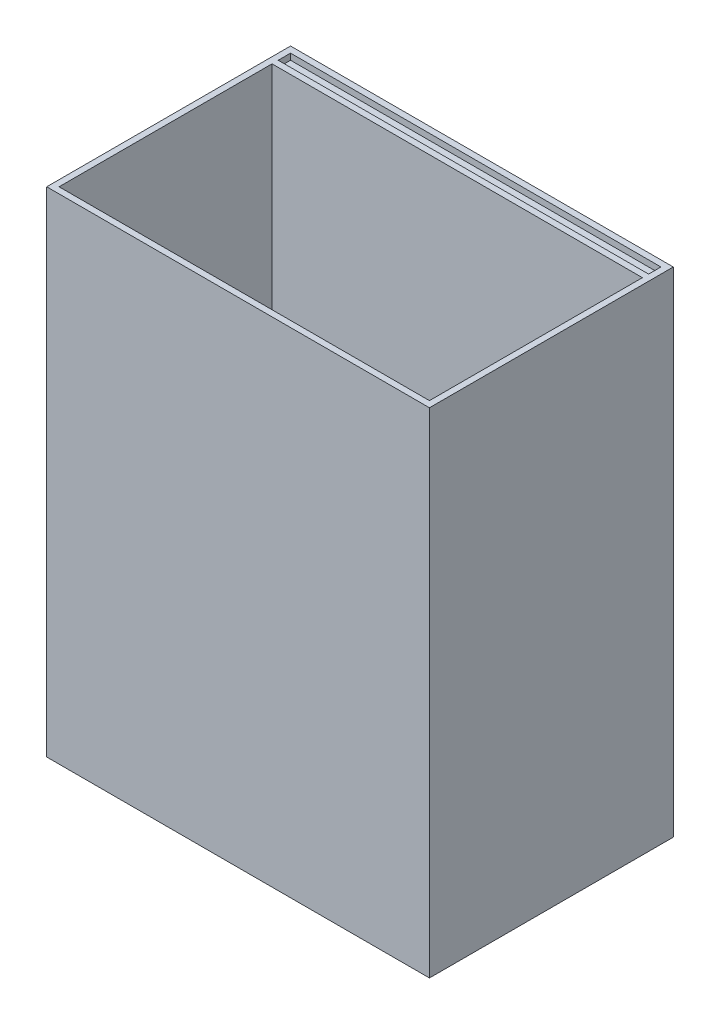
ISO-10303-21;
HEADER;
FILE_DESCRIPTION(('STEP AP214'),'2;1');
FILE_NAME('part.step','',(''),(''),'','','');
FILE_SCHEMA(('AUTOMOTIVE_DESIGN { 1 0 10303 214 1 1 1 1 }'));
ENDSEC;
DATA;
#1=APPLICATION_CONTEXT('core data for automotive mechanical design processes');
#2=APPLICATION_PROTOCOL_DEFINITION('international standard','automotive_design',2000,#1);
#3=PRODUCT_CONTEXT('',#1,'mechanical');
#4=PRODUCT('Part','Part','',(#3));
#5=PRODUCT_RELATED_PRODUCT_CATEGORY('part','',(#4));
#6=PRODUCT_DEFINITION_FORMATION('','',#4);
#7=PRODUCT_DEFINITION_CONTEXT('part definition',#1,'design');
#8=PRODUCT_DEFINITION('design','',#6,#7);
#9=PRODUCT_DEFINITION_SHAPE('','',#8);
#10=(LENGTH_UNIT() NAMED_UNIT(*) SI_UNIT(.MILLI.,.METRE.));
#11=(NAMED_UNIT(*) PLANE_ANGLE_UNIT() SI_UNIT($,.RADIAN.));
#12=(NAMED_UNIT(*) SI_UNIT($,.STERADIAN.) SOLID_ANGLE_UNIT());
#13=UNCERTAINTY_MEASURE_WITH_UNIT(LENGTH_MEASURE(1.E-05),#10,'distance_accuracy_value','');
#14=(GEOMETRIC_REPRESENTATION_CONTEXT(3) GLOBAL_UNCERTAINTY_ASSIGNED_CONTEXT((#13)) GLOBAL_UNIT_ASSIGNED_CONTEXT((#10,
#11,#12)) REPRESENTATION_CONTEXT('',''));
#15=CARTESIAN_POINT('',(0.,0.,0.));
#16=DIRECTION('',(0.,0.,1.));
#17=DIRECTION('',(1.,0.,0.));
#18=AXIS2_PLACEMENT_3D('',#15,#16,#17);
#19=CARTESIAN_POINT('',(6100.,0.,0.));
#20=DIRECTION('',(-1.,0.,0.));
#21=DIRECTION('',(0.,0.,1.));
#22=AXIS2_PLACEMENT_3D('',#19,#20,#21);
#23=PLANE('',#22);
#24=DIRECTION('',(0.,0.,-1.));
#25=VECTOR('',#24,1.);
#26=CARTESIAN_POINT('',(6100.,7900.,0.));
#27=LINE('',#26,#25);
#28=CARTESIAN_POINT('',(6100.,7900.,300.));
#29=VERTEX_POINT('',#28);
#30=CARTESIAN_POINT('',(6100.,7900.,100.));
#31=VERTEX_POINT('',#30);
#32=EDGE_CURVE('E346',#29,#31,#27,.T.);
#33=ORIENTED_EDGE('',*,*,#32,.F.);
#34=DIRECTION('',(0.,-1.,0.));
#35=VECTOR('',#34,1.);
#36=CARTESIAN_POINT('',(6100.,1600.,300.));
#37=LINE('',#36,#35);
#38=CARTESIAN_POINT('',(6100.,8000.,300.));
#39=VERTEX_POINT('',#38);
#40=EDGE_CURVE('E285',#39,#29,#37,.T.);
#41=ORIENTED_EDGE('',*,*,#40,.F.);
#42=DIRECTION('',(0.,0.,1.));
#43=VECTOR('',#42,1.);
#44=CARTESIAN_POINT('',(6100.,8000.,3850.));
#45=LINE('',#44,#43);
#46=CARTESIAN_POINT('',(6100.,8000.,100.));
#47=VERTEX_POINT('',#46);
#48=EDGE_CURVE('E433',#47,#39,#45,.T.);
#49=ORIENTED_EDGE('',*,*,#48,.F.);
#50=DIRECTION('',(0.,1.,0.));
#51=VECTOR('',#50,1.);
#52=CARTESIAN_POINT('',(6100.,100.,100.));
#53=LINE('',#52,#51);
#54=EDGE_CURVE('E427',#31,#47,#53,.T.);
#55=ORIENTED_EDGE('',*,*,#54,.F.);
#56=EDGE_LOOP('',(#33,#41,#49,#55));
#57=FACE_BOUND('',#56,.T.);
#58=ADVANCED_FACE('F40',(#57),#23,.T.);
#59=CARTESIAN_POINT('',(100.,0.,0.));
#60=DIRECTION('',(1.,0.,0.));
#61=DIRECTION('',(0.,0.,-1.));
#62=AXIS2_PLACEMENT_3D('',#59,#60,#61);
#63=PLANE('',#62);
#64=DIRECTION('',(0.,0.,1.));
#65=VECTOR('',#64,1.);
#66=CARTESIAN_POINT('',(100.,7900.,0.));
#67=LINE('',#66,#65);
#68=CARTESIAN_POINT('',(100.,7900.,100.));
#69=VERTEX_POINT('',#68);
#70=CARTESIAN_POINT('',(100.,7900.,300.));
#71=VERTEX_POINT('',#70);
#72=EDGE_CURVE('E343',#69,#71,#67,.T.);
#73=ORIENTED_EDGE('',*,*,#72,.F.);
#74=DIRECTION('',(0.,-1.,0.));
#75=VECTOR('',#74,1.);
#76=CARTESIAN_POINT('',(100.,100.,100.));
#77=LINE('',#76,#75);
#78=CARTESIAN_POINT('',(100.,8000.,100.));
#79=VERTEX_POINT('',#78);
#80=EDGE_CURVE('E402',#79,#69,#77,.T.);
#81=ORIENTED_EDGE('',*,*,#80,.F.);
#82=DIRECTION('',(0.,0.,-1.));
#83=VECTOR('',#82,1.);
#84=CARTESIAN_POINT('',(100.,8000.,100.));
#85=LINE('',#84,#83);
#86=CARTESIAN_POINT('',(100.,8000.,300.));
#87=VERTEX_POINT('',#86);
#88=EDGE_CURVE('E415',#87,#79,#85,.T.);
#89=ORIENTED_EDGE('',*,*,#88,.F.);
#90=DIRECTION('',(0.,1.,0.));
#91=VECTOR('',#90,1.);
#92=CARTESIAN_POINT('',(100.,0.,300.));
#93=LINE('',#92,#91);
#94=EDGE_CURVE('E480',#71,#87,#93,.T.);
#95=ORIENTED_EDGE('',*,*,#94,.F.);
#96=EDGE_LOOP('',(#73,#81,#89,#95));
#97=FACE_BOUND('',#96,.T.);
#98=ADVANCED_FACE('F547',(#97),#63,.T.);
#99=CARTESIAN_POINT('',(0.,0.,100.));
#100=DIRECTION('',(0.,0.,-1.));
#101=DIRECTION('',(-1.,0.,0.));
#102=AXIS2_PLACEMENT_3D('',#99,#100,#101);
#103=PLANE('',#102);
#104=ORIENTED_EDGE('',*,*,#80,.T.);
#105=DIRECTION('',(1.,0.,0.));
#106=VECTOR('',#105,1.);
#107=CARTESIAN_POINT('',(0.,7900.,100.));
#108=LINE('',#107,#106);
#109=EDGE_CURVE('E341',#69,#31,#108,.T.);
#110=ORIENTED_EDGE('',*,*,#109,.T.);
#111=ORIENTED_EDGE('',*,*,#54,.T.);
#112=DIRECTION('',(-1.,0.,0.));
#113=VECTOR('',#112,1.);
#114=CARTESIAN_POINT('',(0.,8000.,100.));
#115=LINE('',#114,#113);
#116=EDGE_CURVE('E455',#47,#79,#115,.T.);
#117=ORIENTED_EDGE('',*,*,#116,.T.);
#118=EDGE_LOOP('',(#104,#110,#111,#117));
#119=FACE_BOUND('',#118,.T.);
#120=ADVANCED_FACE('F537',(#119),#103,.F.);
#121=CARTESIAN_POINT('',(0.,0.,300.));
#122=DIRECTION('',(0.,0.,-1.));
#123=DIRECTION('',(-1.,0.,0.));
#124=AXIS2_PLACEMENT_3D('',#121,#122,#123);
#125=PLANE('',#124);
#126=DIRECTION('',(1.,0.,0.));
#127=VECTOR('',#126,1.);
#128=CARTESIAN_POINT('',(0.,7900.,300.));
#129=LINE('',#128,#127);
#130=EDGE_CURVE('E504',#71,#29,#129,.T.);
#131=ORIENTED_EDGE('',*,*,#130,.F.);
#132=ORIENTED_EDGE('',*,*,#94,.T.);
#133=DIRECTION('',(-1.,0.,0.));
#134=VECTOR('',#133,1.);
#135=CARTESIAN_POINT('',(100.,8000.,300.));
#136=LINE('',#135,#134);
#137=EDGE_CURVE('E381',#39,#87,#136,.T.);
#138=ORIENTED_EDGE('',*,*,#137,.F.);
#139=ORIENTED_EDGE('',*,*,#40,.T.);
#140=EDGE_LOOP('',(#131,#132,#138,#139));
#141=FACE_BOUND('',#140,.T.);
#142=ADVANCED_FACE('F550',(#141),#125,.T.);
#143=CARTESIAN_POINT('',(6100.,8000.,400.));
#144=VERTEX_POINT('',#143);
#145=CARTESIAN_POINT('',(6100.,8000.,3850.));
#146=VERTEX_POINT('',#145);
#147=EDGE_CURVE('E431',#144,#146,#45,.T.);
#148=ORIENTED_EDGE('',*,*,#147,.F.);
#149=DIRECTION('',(0.,-1.,0.));
#150=VECTOR('',#149,1.);
#151=CARTESIAN_POINT('',(6100.,8000.,400.));
#152=LINE('',#151,#150);
#153=CARTESIAN_POINT('',(6100.,1600.,400.));
#154=VERTEX_POINT('',#153);
#155=EDGE_CURVE('E384',#144,#154,#152,.T.);
#156=ORIENTED_EDGE('',*,*,#155,.T.);
#157=DIRECTION('',(0.,0.,1.));
#158=VECTOR('',#157,1.);
#159=CARTESIAN_POINT('',(6100.,1600.,300.));
#160=LINE('',#159,#158);
#161=CARTESIAN_POINT('',(6100.,1600.,3850.));
#162=VERTEX_POINT('',#161);
#163=EDGE_CURVE('E297',#154,#162,#160,.T.);
#164=ORIENTED_EDGE('',*,*,#163,.T.);
#165=DIRECTION('',(0.,-1.,0.));
#166=VECTOR('',#165,1.);
#167=CARTESIAN_POINT('',(6100.,100.,3850.));
#168=LINE('',#167,#166);
#169=EDGE_CURVE('E420',#146,#162,#168,.T.);
#170=ORIENTED_EDGE('',*,*,#169,.F.);
#171=EDGE_LOOP('',(#148,#156,#164,#170));
#172=FACE_BOUND('',#171,.T.);
#173=ADVANCED_FACE('F653',(#172),#23,.T.);
#174=DIRECTION('',(0.,0.,-1.));
#175=VECTOR('',#174,1.);
#176=CARTESIAN_POINT('',(100.,1600.,0.));
#177=LINE('',#176,#175);
#178=CARTESIAN_POINT('',(100.,1600.,3850.));
#179=VERTEX_POINT('',#178);
#180=CARTESIAN_POINT('',(99.9999999999997,1600.,400.));
#181=VERTEX_POINT('',#180);
#182=EDGE_CURVE('E482',#179,#181,#177,.T.);
#183=ORIENTED_EDGE('',*,*,#182,.T.);
#184=DIRECTION('',(0.,-1.,0.));
#185=VECTOR('',#184,1.);
#186=CARTESIAN_POINT('',(100.,8000.,400.));
#187=LINE('',#186,#185);
#188=CARTESIAN_POINT('',(100.,8000.,400.));
#189=VERTEX_POINT('',#188);
#190=EDGE_CURVE('E387',#189,#181,#187,.T.);
#191=ORIENTED_EDGE('',*,*,#190,.F.);
#192=CARTESIAN_POINT('',(100.,8000.,3850.));
#193=VERTEX_POINT('',#192);
#194=EDGE_CURVE('E416',#193,#189,#85,.T.);
#195=ORIENTED_EDGE('',*,*,#194,.F.);
#196=DIRECTION('',(0.,1.,0.));
#197=VECTOR('',#196,1.);
#198=CARTESIAN_POINT('',(100.,100.,3850.));
#199=LINE('',#198,#197);
#200=EDGE_CURVE('E410',#179,#193,#199,.T.);
#201=ORIENTED_EDGE('',*,*,#200,.F.);
#202=EDGE_LOOP('',(#183,#191,#195,#201));
#203=FACE_BOUND('',#202,.T.);
#204=ADVANCED_FACE('F646',(#203),#63,.T.);
#205=CARTESIAN_POINT('',(6100.,1600.,300.));
#206=DIRECTION('',(0.,-1.,0.));
#207=DIRECTION('',(1.,0.,0.));
#208=AXIS2_PLACEMENT_3D('',#205,#206,#207);
#209=PLANE('',#208);
#210=DIRECTION('',(1.,0.,0.));
#211=VECTOR('',#210,1.);
#212=CARTESIAN_POINT('',(99.9999999999997,1600.,400.));
#213=LINE('',#212,#211);
#214=EDGE_CURVE('E378',#181,#154,#213,.T.);
#215=ORIENTED_EDGE('',*,*,#214,.F.);
#216=ORIENTED_EDGE('',*,*,#182,.F.);
#217=DIRECTION('',(1.,0.,0.));
#218=VECTOR('',#217,1.);
#219=CARTESIAN_POINT('',(6100.,1600.,3850.));
#220=LINE('',#219,#218);
#221=EDGE_CURVE('E283',#179,#162,#220,.T.);
#222=ORIENTED_EDGE('',*,*,#221,.T.);
#223=ORIENTED_EDGE('',*,*,#163,.F.);
#224=EDGE_LOOP('',(#215,#216,#222,#223));
#225=FACE_BOUND('',#224,.T.);
#226=ADVANCED_FACE('F638',(#225),#209,.F.);
#227=CARTESIAN_POINT('',(0.,0.,3850.));
#228=DIRECTION('',(0.,0.,-1.));
#229=DIRECTION('',(-1.,0.,0.));
#230=AXIS2_PLACEMENT_3D('',#227,#228,#229);
#231=PLANE('',#230);
#232=ORIENTED_EDGE('',*,*,#169,.T.);
#233=ORIENTED_EDGE('',*,*,#221,.F.);
#234=ORIENTED_EDGE('',*,*,#200,.T.);
#235=DIRECTION('',(-1.,0.,0.));
#236=VECTOR('',#235,1.);
#237=CARTESIAN_POINT('',(0.,8000.,3850.));
#238=LINE('',#237,#236);
#239=EDGE_CURVE('E437',#146,#193,#238,.T.);
#240=ORIENTED_EDGE('',*,*,#239,.F.);
#241=EDGE_LOOP('',(#232,#233,#234,#240));
#242=FACE_BOUND('',#241,.T.);
#243=ADVANCED_FACE('F631',(#242),#231,.T.);
#244=CARTESIAN_POINT('',(0.,0.,100.));
#245=DIRECTION('',(1.,0.,0.));
#246=DIRECTION('',(0.,0.,-1.));
#247=AXIS2_PLACEMENT_3D('',#244,#245,#246);
#248=PLANE('',#247);
#249=DIRECTION('',(0.,-1.,0.));
#250=VECTOR('',#249,1.);
#251=CARTESIAN_POINT('',(0.,0.,0.));
#252=LINE('',#251,#250);
#253=CARTESIAN_POINT('',(0.,8000.,0.));
#254=VERTEX_POINT('',#253);
#255=CARTESIAN_POINT('',(0.,0.,0.));
#256=VERTEX_POINT('',#255);
#257=EDGE_CURVE('E452',#254,#256,#252,.T.);
#258=ORIENTED_EDGE('',*,*,#257,.T.);
#259=DIRECTION('',(0.,0.,-1.));
#260=VECTOR('',#259,1.);
#261=CARTESIAN_POINT('',(0.,0.,100.));
#262=LINE('',#261,#260);
#263=CARTESIAN_POINT('',(0.,0.,3950.));
#264=VERTEX_POINT('',#263);
#265=EDGE_CURVE('E474',#264,#256,#262,.T.);
#266=ORIENTED_EDGE('',*,*,#265,.F.);
#267=DIRECTION('',(0.,-1.,0.));
#268=VECTOR('',#267,1.);
#269=CARTESIAN_POINT('',(0.,0.,3950.));
#270=LINE('',#269,#268);
#271=CARTESIAN_POINT('',(0.,8000.,3950.));
#272=VERTEX_POINT('',#271);
#273=EDGE_CURVE('E443',#272,#264,#270,.T.);
#274=ORIENTED_EDGE('',*,*,#273,.F.);
#275=DIRECTION('',(0.,0.,-1.));
#276=VECTOR('',#275,1.);
#277=CARTESIAN_POINT('',(0.,8000.,100.));
#278=LINE('',#277,#276);
#279=EDGE_CURVE('E458',#272,#254,#278,.T.);
#280=ORIENTED_EDGE('',*,*,#279,.T.);
#281=EDGE_LOOP('',(#258,#266,#274,#280));
#282=FACE_BOUND('',#281,.T.);
#283=ADVANCED_FACE('F42',(#282),#248,.F.);
#284=CARTESIAN_POINT('',(0.,0.,100.));
#285=DIRECTION('',(0.,1.,0.));
#286=DIRECTION('',(0.,0.,1.));
#287=AXIS2_PLACEMENT_3D('',#284,#285,#286);
#288=PLANE('',#287);
#289=DIRECTION('',(1.,0.,0.));
#290=VECTOR('',#289,1.);
#291=CARTESIAN_POINT('',(0.,0.,0.));
#292=LINE('',#291,#290);
#293=CARTESIAN_POINT('',(6200.,0.,0.));
#294=VERTEX_POINT('',#293);
#295=EDGE_CURVE('E461',#256,#294,#292,.T.);
#296=ORIENTED_EDGE('',*,*,#295,.T.);
#297=DIRECTION('',(0.,0.,-1.));
#298=VECTOR('',#297,1.);
#299=CARTESIAN_POINT('',(6200.,0.,100.));
#300=LINE('',#299,#298);
#301=CARTESIAN_POINT('',(6200.,0.,3950.));
#302=VERTEX_POINT('',#301);
#303=EDGE_CURVE('E472',#302,#294,#300,.T.);
#304=ORIENTED_EDGE('',*,*,#303,.F.);
#305=DIRECTION('',(1.,0.,0.));
#306=VECTOR('',#305,1.);
#307=CARTESIAN_POINT('',(0.,0.,3950.));
#308=LINE('',#307,#306);
#309=EDGE_CURVE('E446',#264,#302,#308,.T.);
#310=ORIENTED_EDGE('',*,*,#309,.F.);
#311=ORIENTED_EDGE('',*,*,#265,.T.);
#312=EDGE_LOOP('',(#296,#304,#310,#311));
#313=FACE_BOUND('',#312,.T.);
#314=ADVANCED_FACE('F644',(#313),#288,.F.);
#315=CARTESIAN_POINT('',(6200.,0.,100.));
#316=DIRECTION('',(-1.,0.,0.));
#317=DIRECTION('',(0.,0.,1.));
#318=AXIS2_PLACEMENT_3D('',#315,#316,#317);
#319=PLANE('',#318);
#320=DIRECTION('',(0.,1.,0.));
#321=VECTOR('',#320,1.);
#322=CARTESIAN_POINT('',(6200.,0.,0.));
#323=LINE('',#322,#321);
#324=CARTESIAN_POINT('',(6200.,8000.,0.));
#325=VERTEX_POINT('',#324);
#326=EDGE_CURVE('E464',#294,#325,#323,.T.);
#327=ORIENTED_EDGE('',*,*,#326,.T.);
#328=DIRECTION('',(0.,0.,-1.));
#329=VECTOR('',#328,1.);
#330=CARTESIAN_POINT('',(6200.,8000.,100.));
#331=LINE('',#330,#329);
#332=CARTESIAN_POINT('',(6200.,8000.,3950.));
#333=VERTEX_POINT('',#332);
#334=EDGE_CURVE('E469',#333,#325,#331,.T.);
#335=ORIENTED_EDGE('',*,*,#334,.F.);
#336=DIRECTION('',(0.,1.,0.));
#337=VECTOR('',#336,1.);
#338=CARTESIAN_POINT('',(6200.,0.,3950.));
#339=LINE('',#338,#337);
#340=EDGE_CURVE('E449',#302,#333,#339,.T.);
#341=ORIENTED_EDGE('',*,*,#340,.F.);
#342=ORIENTED_EDGE('',*,*,#303,.T.);
#343=EDGE_LOOP('',(#327,#335,#341,#342));
#344=FACE_BOUND('',#343,.T.);
#345=ADVANCED_FACE('F742',(#344),#319,.F.);
#346=CARTESIAN_POINT('',(0.,8000.,100.));
#347=DIRECTION('',(0.,-1.,0.));
#348=DIRECTION('',(0.,0.,-1.));
#349=AXIS2_PLACEMENT_3D('',#346,#347,#348);
#350=PLANE('',#349);
#351=ORIENTED_EDGE('',*,*,#194,.T.);
#352=DIRECTION('',(1.,0.,0.));
#353=VECTOR('',#352,1.);
#354=CARTESIAN_POINT('',(100.,8000.,400.));
#355=LINE('',#354,#353);
#356=EDGE_CURVE('E379',#189,#144,#355,.T.);
#357=ORIENTED_EDGE('',*,*,#356,.T.);
#358=ORIENTED_EDGE('',*,*,#147,.T.);
#359=ORIENTED_EDGE('',*,*,#239,.T.);
#360=EDGE_LOOP('',(#351,#357,#358,#359));
#361=FACE_BOUND('',#360,.T.);
#362=ORIENTED_EDGE('',*,*,#279,.F.);
#363=DIRECTION('',(-1.,0.,0.));
#364=VECTOR('',#363,1.);
#365=CARTESIAN_POINT('',(0.,8000.,3950.));
#366=LINE('',#365,#364);
#367=EDGE_CURVE('E436',#333,#272,#366,.T.);
#368=ORIENTED_EDGE('',*,*,#367,.F.);
#369=ORIENTED_EDGE('',*,*,#334,.T.);
#370=DIRECTION('',(-1.,0.,0.));
#371=VECTOR('',#370,1.);
#372=CARTESIAN_POINT('',(0.,8000.,0.));
#373=LINE('',#372,#371);
#374=EDGE_CURVE('E459',#325,#254,#373,.T.);
#375=ORIENTED_EDGE('',*,*,#374,.T.);
#376=EDGE_LOOP('',(#362,#368,#369,#375));
#377=FACE_BOUND('',#376,.T.);
#378=ORIENTED_EDGE('',*,*,#137,.T.);
#379=ORIENTED_EDGE('',*,*,#88,.T.);
#380=ORIENTED_EDGE('',*,*,#116,.F.);
#381=ORIENTED_EDGE('',*,*,#48,.T.);
#382=EDGE_LOOP('',(#378,#379,#380,#381));
#383=FACE_BOUND('',#382,.T.);
#384=ADVANCED_FACE('F542',(#361,#377,#383),#350,.F.);
#385=CARTESIAN_POINT('',(0.,0.,0.));
#386=DIRECTION('',(0.,0.,-1.));
#387=DIRECTION('',(-1.,0.,0.));
#388=AXIS2_PLACEMENT_3D('',#385,#386,#387);
#389=PLANE('',#388);
#390=ORIENTED_EDGE('',*,*,#295,.F.);
#391=ORIENTED_EDGE('',*,*,#257,.F.);
#392=ORIENTED_EDGE('',*,*,#374,.F.);
#393=ORIENTED_EDGE('',*,*,#326,.F.);
#394=EDGE_LOOP('',(#390,#391,#392,#393));
#395=FACE_BOUND('',#394,.T.);
#396=ADVANCED_FACE('F730',(#395),#389,.T.);
#397=CARTESIAN_POINT('',(0.,0.,3950.));
#398=DIRECTION('',(0.,0.,-1.));
#399=DIRECTION('',(-1.,0.,0.));
#400=AXIS2_PLACEMENT_3D('',#397,#398,#399);
#401=PLANE('',#400);
#402=ORIENTED_EDGE('',*,*,#273,.T.);
#403=ORIENTED_EDGE('',*,*,#309,.T.);
#404=ORIENTED_EDGE('',*,*,#340,.T.);
#405=ORIENTED_EDGE('',*,*,#367,.T.);
#406=EDGE_LOOP('',(#402,#403,#404,#405));
#407=FACE_BOUND('',#406,.T.);
#408=ADVANCED_FACE('F724',(#407),#401,.F.);
#409=CARTESIAN_POINT('',(100.,8000.,400.));
#410=DIRECTION('',(0.,0.,-1.));
#411=DIRECTION('',(-1.,0.,0.));
#412=AXIS2_PLACEMENT_3D('',#409,#410,#411);
#413=PLANE('',#412);
#414=ORIENTED_EDGE('',*,*,#214,.T.);
#415=ORIENTED_EDGE('',*,*,#155,.F.);
#416=ORIENTED_EDGE('',*,*,#356,.F.);
#417=ORIENTED_EDGE('',*,*,#190,.T.);
#418=EDGE_LOOP('',(#414,#415,#416,#417));
#419=FACE_BOUND('',#418,.T.);
#420=ADVANCED_FACE('F722',(#419),#413,.F.);
#421=CARTESIAN_POINT('',(6200.,7900.,300.));
#422=DIRECTION('',(0.,1.,0.));
#423=DIRECTION('',(0.,0.,1.));
#424=AXIS2_PLACEMENT_3D('',#421,#422,#423);
#425=PLANE('',#424);
#426=ORIENTED_EDGE('',*,*,#130,.T.);
#427=ORIENTED_EDGE('',*,*,#32,.T.);
#428=ORIENTED_EDGE('',*,*,#109,.F.);
#429=ORIENTED_EDGE('',*,*,#72,.T.);
#430=EDGE_LOOP('',(#426,#427,#428,#429));
#431=FACE_BOUND('',#430,.T.);
#432=ADVANCED_FACE('F549',(#431),#425,.T.);
#433=CLOSED_SHELL('',(#58,#98,#120,#142,#173,#204,#226,#243,#283,#314,#345,#384,#396,#408,#420,#432));
#434=CARTESIAN_POINT('',(6200.,5700.,300.));
#435=DIRECTION('',(0.,-1.,0.));
#436=DIRECTION('',(0.,0.,-1.));
#437=AXIS2_PLACEMENT_3D('',#434,#435,#436);
#438=PLANE('',#437);
#439=DIRECTION('',(-1.,0.,0.));
#440=VECTOR('',#439,1.);
#441=CARTESIAN_POINT('',(6200.,5700.,300.));
#442=LINE('',#441,#440);
#443=CARTESIAN_POINT('',(6100.,5700.,300.));
#444=VERTEX_POINT('',#443);
#445=CARTESIAN_POINT('',(100.,5700.,300.));
#446=VERTEX_POINT('',#445);
#447=EDGE_CURVE('E317',#444,#446,#442,.T.);
#448=ORIENTED_EDGE('',*,*,#447,.T.);
#449=DIRECTION('',(0.,0.,-1.));
#450=VECTOR('',#449,1.);
#451=CARTESIAN_POINT('',(100.,5700.,0.));
#452=LINE('',#451,#450);
#453=CARTESIAN_POINT('',(100.,5700.,100.));
#454=VERTEX_POINT('',#453);
#455=EDGE_CURVE('E327',#446,#454,#452,.T.);
#456=ORIENTED_EDGE('',*,*,#455,.T.);
#457=DIRECTION('',(-1.,0.,0.));
#458=VECTOR('',#457,1.);
#459=CARTESIAN_POINT('',(0.,5700.,100.));
#460=LINE('',#459,#458);
#461=CARTESIAN_POINT('',(6100.,5700.,100.));
#462=VERTEX_POINT('',#461);
#463=EDGE_CURVE('E321',#462,#454,#460,.T.);
#464=ORIENTED_EDGE('',*,*,#463,.F.);
#465=DIRECTION('',(0.,0.,1.));
#466=VECTOR('',#465,1.);
#467=CARTESIAN_POINT('',(6100.,5700.,0.));
#468=LINE('',#467,#466);
#469=EDGE_CURVE('E507',#462,#444,#468,.T.);
#470=ORIENTED_EDGE('',*,*,#469,.T.);
#471=EDGE_LOOP('',(#448,#456,#464,#470));
#472=FACE_BOUND('',#471,.T.);
#473=ADVANCED_FACE('F563',(#472),#438,.T.);
#474=CARTESIAN_POINT('',(100.,5200.,100.));
#475=VERTEX_POINT('',#474);
#476=EDGE_CURVE('E518',#454,#475,#77,.T.);
#477=ORIENTED_EDGE('',*,*,#476,.T.);
#478=DIRECTION('',(1.,0.,0.));
#479=VECTOR('',#478,1.);
#480=CARTESIAN_POINT('',(0.,5200.,100.));
#481=LINE('',#480,#479);
#482=CARTESIAN_POINT('',(6100.,5200.,100.));
#483=VERTEX_POINT('',#482);
#484=EDGE_CURVE('E11',#475,#483,#481,.T.);
#485=ORIENTED_EDGE('',*,*,#484,.T.);
#486=EDGE_CURVE('E432',#483,#462,#53,.T.);
#487=ORIENTED_EDGE('',*,*,#486,.T.);
#488=ORIENTED_EDGE('',*,*,#463,.T.);
#489=EDGE_LOOP('',(#477,#485,#487,#488));
#490=FACE_BOUND('',#489,.T.);
#491=ADVANCED_FACE('F571',(#490),#103,.F.);
#492=DIRECTION('',(1.,0.,0.));
#493=VECTOR('',#492,1.);
#494=CARTESIAN_POINT('',(6200.,5200.,300.));
#495=LINE('',#494,#493);
#496=CARTESIAN_POINT('',(99.9999999999996,5200.,300.));
#497=VERTEX_POINT('',#496);
#498=CARTESIAN_POINT('',(6100.,5200.,300.));
#499=VERTEX_POINT('',#498);
#500=EDGE_CURVE('E275',#497,#499,#495,.T.);
#501=ORIENTED_EDGE('',*,*,#500,.F.);
#502=EDGE_CURVE('E483',#497,#446,#93,.T.);
#503=ORIENTED_EDGE('',*,*,#502,.T.);
#504=ORIENTED_EDGE('',*,*,#447,.F.);
#505=EDGE_CURVE('E282',#444,#499,#37,.T.);
#506=ORIENTED_EDGE('',*,*,#505,.T.);
#507=EDGE_LOOP('',(#501,#503,#504,#506));
#508=FACE_BOUND('',#507,.T.);
#509=ADVANCED_FACE('F557',(#508),#125,.T.);
#510=DIRECTION('',(0.,0.,-1.));
#511=VECTOR('',#510,1.);
#512=CARTESIAN_POINT('',(6100.,5200.,0.));
#513=LINE('',#512,#511);
#514=EDGE_CURVE('E64',#499,#483,#513,.T.);
#515=ORIENTED_EDGE('',*,*,#514,.F.);
#516=ORIENTED_EDGE('',*,*,#505,.F.);
#517=ORIENTED_EDGE('',*,*,#469,.F.);
#518=ORIENTED_EDGE('',*,*,#486,.F.);
#519=EDGE_LOOP('',(#515,#516,#517,#518));
#520=FACE_BOUND('',#519,.T.);
#521=ADVANCED_FACE('F567',(#520),#23,.T.);
#522=DIRECTION('',(0.,0.,1.));
#523=VECTOR('',#522,1.);
#524=CARTESIAN_POINT('',(100.,5200.,0.));
#525=LINE('',#524,#523);
#526=EDGE_CURVE('E318',#475,#497,#525,.T.);
#527=ORIENTED_EDGE('',*,*,#526,.F.);
#528=ORIENTED_EDGE('',*,*,#476,.F.);
#529=ORIENTED_EDGE('',*,*,#455,.F.);
#530=ORIENTED_EDGE('',*,*,#502,.F.);
#531=EDGE_LOOP('',(#527,#528,#529,#530));
#532=FACE_BOUND('',#531,.T.);
#533=ADVANCED_FACE('F560',(#532),#63,.T.);
#534=CARTESIAN_POINT('',(6200.,5200.,300.));
#535=DIRECTION('',(0.,1.,0.));
#536=DIRECTION('',(0.,0.,1.));
#537=AXIS2_PLACEMENT_3D('',#534,#535,#536);
#538=PLANE('',#537);
#539=ORIENTED_EDGE('',*,*,#484,.F.);
#540=ORIENTED_EDGE('',*,*,#526,.T.);
#541=ORIENTED_EDGE('',*,*,#500,.T.);
#542=ORIENTED_EDGE('',*,*,#514,.T.);
#543=EDGE_LOOP('',(#539,#540,#541,#542));
#544=FACE_BOUND('',#543,.T.);
#545=ADVANCED_FACE('F570',(#544),#538,.T.);
#546=CLOSED_SHELL('',(#473,#491,#509,#521,#533,#545));
#547=CARTESIAN_POINT('',(6100.,1401.72309910255,300.));
#548=DIRECTION('',(0.,1.,0.));
#549=DIRECTION('',(0.,0.,1.));
#550=AXIS2_PLACEMENT_3D('',#547,#548,#549);
#551=PLANE('',#550);
#552=DIRECTION('',(0.,0.,1.));
#553=VECTOR('',#552,1.);
#554=CARTESIAN_POINT('',(6100.,1401.72309910255,300.));
#555=LINE('',#554,#553);
#556=CARTESIAN_POINT('',(6100.,1401.72309910255,300.));
#557=VERTEX_POINT('',#556);
#558=CARTESIAN_POINT('',(6100.,1401.72309910255,375.));
#559=VERTEX_POINT('',#558);
#560=EDGE_CURVE('E280',#557,#559,#555,.T.);
#561=ORIENTED_EDGE('',*,*,#560,.T.);
#562=DIRECTION('',(-1.,0.,0.));
#563=VECTOR('',#562,1.);
#564=CARTESIAN_POINT('',(6100.,1401.72309910255,375.));
#565=LINE('',#564,#563);
#566=CARTESIAN_POINT('',(100.,1401.72309910255,375.));
#567=VERTEX_POINT('',#566);
#568=EDGE_CURVE('E497',#559,#567,#565,.T.);
#569=ORIENTED_EDGE('',*,*,#568,.T.);
#570=DIRECTION('',(0.,0.,1.));
#571=VECTOR('',#570,1.);
#572=CARTESIAN_POINT('',(100.,1401.72309910255,0.));
#573=LINE('',#572,#571);
#574=CARTESIAN_POINT('',(100.,1401.72309910255,300.));
#575=VERTEX_POINT('',#574);
#576=EDGE_CURVE('E487',#575,#567,#573,.T.);
#577=ORIENTED_EDGE('',*,*,#576,.F.);
#578=DIRECTION('',(-1.,0.,0.));
#579=VECTOR('',#578,1.);
#580=CARTESIAN_POINT('',(6100.,1401.72309910255,300.));
#581=LINE('',#580,#579);
#582=EDGE_CURVE('E293',#557,#575,#581,.T.);
#583=ORIENTED_EDGE('',*,*,#582,.F.);
#584=EDGE_LOOP('',(#561,#569,#577,#583));
#585=FACE_BOUND('',#584,.T.);
#586=ADVANCED_FACE('F592',(#585),#551,.F.);
#587=CARTESIAN_POINT('',(0.,1500.,375.));
#588=DIRECTION('',(0.,0.,-1.));
#589=DIRECTION('',(-1.,0.,0.));
#590=AXIS2_PLACEMENT_3D('',#587,#588,#589);
#591=PLANE('',#590);
#592=DIRECTION('',(1.,0.,0.));
#593=VECTOR('',#592,1.);
#594=CARTESIAN_POINT('',(0.,100.,375.));
#595=LINE('',#594,#593);
#596=CARTESIAN_POINT('',(100.,100.,375.));
#597=VERTEX_POINT('',#596);
#598=CARTESIAN_POINT('',(6100.,100.,375.));
#599=VERTEX_POINT('',#598);
#600=EDGE_CURVE('E353',#597,#599,#595,.T.);
#601=ORIENTED_EDGE('',*,*,#600,.F.);
#602=DIRECTION('',(0.,1.,0.));
#603=VECTOR('',#602,1.);
#604=CARTESIAN_POINT('',(100.,0.,375.));
#605=LINE('',#604,#603);
#606=EDGE_CURVE('E349',#597,#567,#605,.T.);
#607=ORIENTED_EDGE('',*,*,#606,.T.);
#608=ORIENTED_EDGE('',*,*,#568,.F.);
#609=DIRECTION('',(0.,-1.,0.));
#610=VECTOR('',#609,1.);
#611=CARTESIAN_POINT('',(6100.,0.,375.));
#612=LINE('',#611,#610);
#613=EDGE_CURVE('E351',#559,#599,#612,.T.);
#614=ORIENTED_EDGE('',*,*,#613,.T.);
#615=EDGE_LOOP('',(#601,#607,#608,#614));
#616=FACE_BOUND('',#615,.T.);
#617=ADVANCED_FACE('F594',(#616),#591,.T.);
#618=CARTESIAN_POINT('',(0.,100.,3950.));
#619=DIRECTION('',(0.,-1.,0.));
#620=DIRECTION('',(0.,0.,-1.));
#621=AXIS2_PLACEMENT_3D('',#618,#619,#620);
#622=PLANE('',#621);
#623=DIRECTION('',(0.,0.,1.));
#624=VECTOR('',#623,1.);
#625=CARTESIAN_POINT('',(100.,100.,100.));
#626=LINE('',#625,#624);
#627=CARTESIAN_POINT('',(100.,100.,100.));
#628=VERTEX_POINT('',#627);
#629=EDGE_CURVE('E407',#628,#597,#626,.T.);
#630=ORIENTED_EDGE('',*,*,#629,.T.);
#631=ORIENTED_EDGE('',*,*,#600,.T.);
#632=DIRECTION('',(0.,0.,-1.));
#633=VECTOR('',#632,1.);
#634=CARTESIAN_POINT('',(6100.,100.,3850.));
#635=LINE('',#634,#633);
#636=CARTESIAN_POINT('',(6100.,100.,100.));
#637=VERTEX_POINT('',#636);
#638=EDGE_CURVE('E423',#599,#637,#635,.T.);
#639=ORIENTED_EDGE('',*,*,#638,.T.);
#640=DIRECTION('',(-1.,0.,0.));
#641=VECTOR('',#640,1.);
#642=CARTESIAN_POINT('',(0.,100.,100.));
#643=LINE('',#642,#641);
#644=EDGE_CURVE('E440',#637,#628,#643,.T.);
#645=ORIENTED_EDGE('',*,*,#644,.T.);
#646=EDGE_LOOP('',(#630,#631,#639,#645));
#647=FACE_BOUND('',#646,.T.);
#648=ADVANCED_FACE('F603',(#647),#622,.F.);
#649=DIRECTION('',(0.,0.,-1.));
#650=VECTOR('',#649,1.);
#651=CARTESIAN_POINT('',(100.,5100.,0.));
#652=LINE('',#651,#650);
#653=CARTESIAN_POINT('',(99.9999999999996,5100.,300.));
#654=VERTEX_POINT('',#653);
#655=CARTESIAN_POINT('',(100.,5100.,100.));
#656=VERTEX_POINT('',#655);
#657=EDGE_CURVE('E56',#654,#656,#652,.T.);
#658=ORIENTED_EDGE('',*,*,#657,.F.);
#659=EDGE_CURVE('E274',#575,#654,#93,.T.);
#660=ORIENTED_EDGE('',*,*,#659,.F.);
#661=ORIENTED_EDGE('',*,*,#576,.T.);
#662=ORIENTED_EDGE('',*,*,#606,.F.);
#663=ORIENTED_EDGE('',*,*,#629,.F.);
#664=EDGE_CURVE('E400',#656,#628,#77,.T.);
#665=ORIENTED_EDGE('',*,*,#664,.F.);
#666=EDGE_LOOP('',(#658,#660,#661,#662,#663,#665));
#667=FACE_BOUND('',#666,.T.);
#668=ADVANCED_FACE('F516',(#667),#63,.T.);
#669=DIRECTION('',(0.,0.,1.));
#670=VECTOR('',#669,1.);
#671=CARTESIAN_POINT('',(6100.,5100.,0.));
#672=LINE('',#671,#670);
#673=CARTESIAN_POINT('',(6100.,5100.,100.));
#674=VERTEX_POINT('',#673);
#675=CARTESIAN_POINT('',(6100.,5100.,300.));
#676=VERTEX_POINT('',#675);
#677=EDGE_CURVE('E259',#674,#676,#672,.T.);
#678=ORIENTED_EDGE('',*,*,#677,.F.);
#679=EDGE_CURVE('E429',#637,#674,#53,.T.);
#680=ORIENTED_EDGE('',*,*,#679,.F.);
#681=ORIENTED_EDGE('',*,*,#638,.F.);
#682=ORIENTED_EDGE('',*,*,#613,.F.);
#683=ORIENTED_EDGE('',*,*,#560,.F.);
#684=EDGE_CURVE('E272',#676,#557,#37,.T.);
#685=ORIENTED_EDGE('',*,*,#684,.F.);
#686=EDGE_LOOP('',(#678,#680,#681,#682,#683,#685));
#687=FACE_BOUND('',#686,.T.);
#688=ADVANCED_FACE('F277',(#687),#23,.T.);
#689=DIRECTION('',(-1.,0.,0.));
#690=VECTOR('',#689,1.);
#691=CARTESIAN_POINT('',(6200.,5100.,300.));
#692=LINE('',#691,#690);
#693=EDGE_CURVE('E262',#676,#654,#692,.T.);
#694=ORIENTED_EDGE('',*,*,#693,.F.);
#695=ORIENTED_EDGE('',*,*,#684,.T.);
#696=ORIENTED_EDGE('',*,*,#582,.T.);
#697=ORIENTED_EDGE('',*,*,#659,.T.);
#698=EDGE_LOOP('',(#694,#695,#696,#697));
#699=FACE_BOUND('',#698,.T.);
#700=ADVANCED_FACE('F270',(#699),#125,.T.);
#701=ORIENTED_EDGE('',*,*,#679,.T.);
#702=DIRECTION('',(-1.,0.,0.));
#703=VECTOR('',#702,1.);
#704=CARTESIAN_POINT('',(0.,5100.,100.));
#705=LINE('',#704,#703);
#706=EDGE_CURVE('E49',#674,#656,#705,.T.);
#707=ORIENTED_EDGE('',*,*,#706,.T.);
#708=ORIENTED_EDGE('',*,*,#664,.T.);
#709=ORIENTED_EDGE('',*,*,#644,.F.);
#710=EDGE_LOOP('',(#701,#707,#708,#709));
#711=FACE_BOUND('',#710,.T.);
#712=ADVANCED_FACE('F512',(#711),#103,.F.);
#713=CARTESIAN_POINT('',(6200.,5100.,300.));
#714=DIRECTION('',(0.,-1.,0.));
#715=DIRECTION('',(0.,0.,-1.));
#716=AXIS2_PLACEMENT_3D('',#713,#714,#715);
#717=PLANE('',#716);
#718=ORIENTED_EDGE('',*,*,#693,.T.);
#719=ORIENTED_EDGE('',*,*,#657,.T.);
#720=ORIENTED_EDGE('',*,*,#706,.F.);
#721=ORIENTED_EDGE('',*,*,#677,.T.);
#722=EDGE_LOOP('',(#718,#719,#720,#721));
#723=FACE_BOUND('',#722,.T.);
#724=ADVANCED_FACE('F261',(#723),#717,.T.);
#725=CLOSED_SHELL('',(#586,#617,#648,#668,#688,#700,#712,#724));
#726=CARTESIAN_POINT('',(100.,7800.,100.));
#727=VERTEX_POINT('',#726);
#728=CARTESIAN_POINT('',(100.,5800.,100.));
#729=VERTEX_POINT('',#728);
#730=EDGE_CURVE('E406',#727,#729,#77,.T.);
#731=ORIENTED_EDGE('',*,*,#730,.T.);
#732=DIRECTION('',(1.,0.,0.));
#733=VECTOR('',#732,1.);
#734=CARTESIAN_POINT('',(0.,5800.,100.));
#735=LINE('',#734,#733);
#736=CARTESIAN_POINT('',(6100.,5800.,100.));
#737=VERTEX_POINT('',#736);
#738=EDGE_CURVE('E330',#729,#737,#735,.T.);
#739=ORIENTED_EDGE('',*,*,#738,.T.);
#740=CARTESIAN_POINT('',(6100.,7800.,100.));
#741=VERTEX_POINT('',#740);
#742=EDGE_CURVE('E533',#737,#741,#53,.T.);
#743=ORIENTED_EDGE('',*,*,#742,.T.);
#744=DIRECTION('',(-1.,0.,0.));
#745=VECTOR('',#744,1.);
#746=CARTESIAN_POINT('',(0.,7800.,100.));
#747=LINE('',#746,#745);
#748=EDGE_CURVE('E334',#741,#727,#747,.T.);
#749=ORIENTED_EDGE('',*,*,#748,.T.);
#750=EDGE_LOOP('',(#731,#739,#743,#749));
#751=FACE_BOUND('',#750,.T.);
#752=ADVANCED_FACE('F525',(#751),#103,.F.);
#753=DIRECTION('',(1.,0.,0.));
#754=VECTOR('',#753,1.);
#755=CARTESIAN_POINT('',(6200.,5800.,300.));
#756=LINE('',#755,#754);
#757=CARTESIAN_POINT('',(100.,5800.,300.));
#758=VERTEX_POINT('',#757);
#759=CARTESIAN_POINT('',(6100.,5800.,300.));
#760=VERTEX_POINT('',#759);
#761=EDGE_CURVE('E303',#758,#760,#756,.T.);
#762=ORIENTED_EDGE('',*,*,#761,.F.);
#763=CARTESIAN_POINT('',(99.9999999999996,7800.,300.));
#764=VERTEX_POINT('',#763);
#765=EDGE_CURVE('E551',#758,#764,#93,.T.);
#766=ORIENTED_EDGE('',*,*,#765,.T.);
#767=DIRECTION('',(-1.,0.,0.));
#768=VECTOR('',#767,1.);
#769=CARTESIAN_POINT('',(0.,7800.,300.));
#770=LINE('',#769,#768);
#771=CARTESIAN_POINT('',(6100.,7800.,300.));
#772=VERTEX_POINT('',#771);
#773=EDGE_CURVE('E306',#772,#764,#770,.T.);
#774=ORIENTED_EDGE('',*,*,#773,.F.);
#775=EDGE_CURVE('E287',#772,#760,#37,.T.);
#776=ORIENTED_EDGE('',*,*,#775,.T.);
#777=EDGE_LOOP('',(#762,#766,#774,#776));
#778=FACE_BOUND('',#777,.T.);
#779=ADVANCED_FACE('F302',(#778),#125,.T.);
#780=DIRECTION('',(0.,0.,1.));
#781=VECTOR('',#780,1.);
#782=CARTESIAN_POINT('',(100.,5800.,0.));
#783=LINE('',#782,#781);
#784=EDGE_CURVE('E316',#729,#758,#783,.T.);
#785=ORIENTED_EDGE('',*,*,#784,.F.);
#786=ORIENTED_EDGE('',*,*,#730,.F.);
#787=DIRECTION('',(0.,0.,-1.));
#788=VECTOR('',#787,1.);
#789=CARTESIAN_POINT('',(100.,7800.,0.));
#790=LINE('',#789,#788);
#791=EDGE_CURVE('E336',#764,#727,#790,.T.);
#792=ORIENTED_EDGE('',*,*,#791,.F.);
#793=ORIENTED_EDGE('',*,*,#765,.F.);
#794=EDGE_LOOP('',(#785,#786,#792,#793));
#795=FACE_BOUND('',#794,.T.);
#796=ADVANCED_FACE('F529',(#795),#63,.T.);
#797=DIRECTION('',(0.,0.,-1.));
#798=VECTOR('',#797,1.);
#799=CARTESIAN_POINT('',(6100.,5800.,0.));
#800=LINE('',#799,#798);
#801=EDGE_CURVE('E315',#760,#737,#800,.T.);
#802=ORIENTED_EDGE('',*,*,#801,.F.);
#803=ORIENTED_EDGE('',*,*,#775,.F.);
#804=DIRECTION('',(0.,0.,1.));
#805=VECTOR('',#804,1.);
#806=CARTESIAN_POINT('',(6100.,7800.,0.));
#807=LINE('',#806,#805);
#808=EDGE_CURVE('E339',#741,#772,#807,.T.);
#809=ORIENTED_EDGE('',*,*,#808,.F.);
#810=ORIENTED_EDGE('',*,*,#742,.F.);
#811=EDGE_LOOP('',(#802,#803,#809,#810));
#812=FACE_BOUND('',#811,.T.);
#813=ADVANCED_FACE('F532',(#812),#23,.T.);
#814=CARTESIAN_POINT('',(6200.,7800.,300.));
#815=DIRECTION('',(0.,-1.,0.));
#816=DIRECTION('',(0.,0.,-1.));
#817=AXIS2_PLACEMENT_3D('',#814,#815,#816);
#818=PLANE('',#817);
#819=ORIENTED_EDGE('',*,*,#748,.F.);
#820=ORIENTED_EDGE('',*,*,#808,.T.);
#821=ORIENTED_EDGE('',*,*,#773,.T.);
#822=ORIENTED_EDGE('',*,*,#791,.T.);
#823=EDGE_LOOP('',(#819,#820,#821,#822));
#824=FACE_BOUND('',#823,.T.);
#825=ADVANCED_FACE('F531',(#824),#818,.T.);
#826=CARTESIAN_POINT('',(6200.,5800.,300.));
#827=DIRECTION('',(0.,1.,0.));
#828=DIRECTION('',(0.,0.,1.));
#829=AXIS2_PLACEMENT_3D('',#826,#827,#828);
#830=PLANE('',#829);
#831=ORIENTED_EDGE('',*,*,#738,.F.);
#832=ORIENTED_EDGE('',*,*,#784,.T.);
#833=ORIENTED_EDGE('',*,*,#761,.T.);
#834=ORIENTED_EDGE('',*,*,#801,.T.);
#835=EDGE_LOOP('',(#831,#832,#833,#834));
#836=FACE_BOUND('',#835,.T.);
#837=ADVANCED_FACE('F314',(#836),#830,.T.);
#838=CLOSED_SHELL('',(#752,#779,#796,#813,#825,#837));
#839=CARTESIAN_POINT('',(0.,1500.,3475.));
#840=DIRECTION('',(0.,0.,-1.));
#841=DIRECTION('',(-1.,0.,0.));
#842=AXIS2_PLACEMENT_3D('',#839,#840,#841);
#843=PLANE('',#842);
#844=DIRECTION('',(1.,0.,0.));
#845=VECTOR('',#844,1.);
#846=CARTESIAN_POINT('',(0.,100.,3475.));
#847=LINE('',#846,#845);
#848=CARTESIAN_POINT('',(100.,100.,3475.));
#849=VERTEX_POINT('',#848);
#850=CARTESIAN_POINT('',(6100.,100.,3475.));
#851=VERTEX_POINT('',#850);
#852=EDGE_CURVE('E368',#849,#851,#847,.T.);
#853=ORIENTED_EDGE('',*,*,#852,.F.);
#854=DIRECTION('',(0.,1.,0.));
#855=VECTOR('',#854,1.);
#856=CARTESIAN_POINT('',(100.,0.,3475.));
#857=LINE('',#856,#855);
#858=CARTESIAN_POINT('',(100.,1401.72309910255,3475.));
#859=VERTEX_POINT('',#858);
#860=EDGE_CURVE('E363',#849,#859,#857,.T.);
#861=ORIENTED_EDGE('',*,*,#860,.T.);
#862=DIRECTION('',(-1.,0.,0.));
#863=VECTOR('',#862,1.);
#864=CARTESIAN_POINT('',(6100.,1401.72309910255,3475.));
#865=LINE('',#864,#863);
#866=CARTESIAN_POINT('',(6100.,1401.72309910255,3475.));
#867=VERTEX_POINT('',#866);
#868=EDGE_CURVE('E490',#867,#859,#865,.T.);
#869=ORIENTED_EDGE('',*,*,#868,.F.);
#870=DIRECTION('',(0.,-1.,0.));
#871=VECTOR('',#870,1.);
#872=CARTESIAN_POINT('',(6100.,0.,3475.));
#873=LINE('',#872,#871);
#874=EDGE_CURVE('E366',#867,#851,#873,.T.);
#875=ORIENTED_EDGE('',*,*,#874,.T.);
#876=EDGE_LOOP('',(#853,#861,#869,#875));
#877=FACE_BOUND('',#876,.T.);
#878=ADVANCED_FACE('F704',(#877),#843,.T.);
#879=CARTESIAN_POINT('',(6100.,100.,475.));
#880=VERTEX_POINT('',#879);
#881=EDGE_CURVE('E428',#851,#880,#635,.T.);
#882=ORIENTED_EDGE('',*,*,#881,.T.);
#883=DIRECTION('',(-1.,0.,0.));
#884=VECTOR('',#883,1.);
#885=CARTESIAN_POINT('',(0.,100.,475.));
#886=LINE('',#885,#884);
#887=CARTESIAN_POINT('',(100.,100.,475.));
#888=VERTEX_POINT('',#887);
#889=EDGE_CURVE('E360',#880,#888,#886,.T.);
#890=ORIENTED_EDGE('',*,*,#889,.T.);
#891=EDGE_CURVE('E411',#888,#849,#626,.T.);
#892=ORIENTED_EDGE('',*,*,#891,.T.);
#893=ORIENTED_EDGE('',*,*,#852,.T.);
#894=EDGE_LOOP('',(#882,#890,#892,#893));
#895=FACE_BOUND('',#894,.T.);
#896=ADVANCED_FACE('F610',(#895),#622,.F.);
#897=CARTESIAN_POINT('',(99.9999999999996,1401.72309910255,475.));
#898=VERTEX_POINT('',#897);
#899=EDGE_CURVE('E491',#898,#859,#573,.T.);
#900=ORIENTED_EDGE('',*,*,#899,.F.);
#901=DIRECTION('',(1.,0.,0.));
#902=VECTOR('',#901,1.);
#903=CARTESIAN_POINT('',(6100.,1401.72309910255,475.));
#904=LINE('',#903,#902);
#905=CARTESIAN_POINT('',(6100.,1401.72309910255,475.));
#906=VERTEX_POINT('',#905);
#907=EDGE_CURVE('E500',#898,#906,#904,.T.);
#908=ORIENTED_EDGE('',*,*,#907,.T.);
#909=EDGE_CURVE('E401',#906,#867,#555,.T.);
#910=ORIENTED_EDGE('',*,*,#909,.T.);
#911=ORIENTED_EDGE('',*,*,#868,.T.);
#912=EDGE_LOOP('',(#900,#908,#910,#911));
#913=FACE_BOUND('',#912,.T.);
#914=ADVANCED_FACE('F597',(#913),#551,.F.);
#915=DIRECTION('',(0.,-1.,0.));
#916=VECTOR('',#915,1.);
#917=CARTESIAN_POINT('',(100.,0.,475.));
#918=LINE('',#917,#916);
#919=EDGE_CURVE('E356',#898,#888,#918,.T.);
#920=ORIENTED_EDGE('',*,*,#919,.F.);
#921=ORIENTED_EDGE('',*,*,#899,.T.);
#922=ORIENTED_EDGE('',*,*,#860,.F.);
#923=ORIENTED_EDGE('',*,*,#891,.F.);
#924=EDGE_LOOP('',(#920,#921,#922,#923));
#925=FACE_BOUND('',#924,.T.);
#926=ADVANCED_FACE('F609',(#925),#63,.T.);
#927=DIRECTION('',(0.,1.,0.));
#928=VECTOR('',#927,1.);
#929=CARTESIAN_POINT('',(6100.,0.,475.));
#930=LINE('',#929,#928);
#931=EDGE_CURVE('E358',#880,#906,#930,.T.);
#932=ORIENTED_EDGE('',*,*,#931,.F.);
#933=ORIENTED_EDGE('',*,*,#881,.F.);
#934=ORIENTED_EDGE('',*,*,#874,.F.);
#935=ORIENTED_EDGE('',*,*,#909,.F.);
#936=EDGE_LOOP('',(#932,#933,#934,#935));
#937=FACE_BOUND('',#936,.T.);
#938=ADVANCED_FACE('F649',(#937),#23,.T.);
#939=CARTESIAN_POINT('',(0.,1500.,475.));
#940=DIRECTION('',(0.,0.,1.));
#941=DIRECTION('',(1.,0.,0.));
#942=AXIS2_PLACEMENT_3D('',#939,#940,#941);
#943=PLANE('',#942);
#944=ORIENTED_EDGE('',*,*,#889,.F.);
#945=ORIENTED_EDGE('',*,*,#931,.T.);
#946=ORIENTED_EDGE('',*,*,#907,.F.);
#947=ORIENTED_EDGE('',*,*,#919,.T.);
#948=EDGE_LOOP('',(#944,#945,#946,#947));
#949=FACE_BOUND('',#948,.T.);
#950=ADVANCED_FACE('F655',(#949),#943,.T.);
#951=CLOSED_SHELL('',(#878,#896,#914,#926,#938,#950));
#952=CARTESIAN_POINT('',(100.,100.,3850.));
#953=VERTEX_POINT('',#952);
#954=CARTESIAN_POINT('',(100.,1401.72309910255,3850.));
#955=VERTEX_POINT('',#954);
#956=EDGE_CURVE('E412',#953,#955,#199,.T.);
#957=ORIENTED_EDGE('',*,*,#956,.T.);
#958=DIRECTION('',(-1.,0.,0.));
#959=VECTOR('',#958,1.);
#960=CARTESIAN_POINT('',(6100.,1401.72309910255,3850.));
#961=LINE('',#960,#959);
#962=CARTESIAN_POINT('',(6100.,1401.72309910255,3850.));
#963=VERTEX_POINT('',#962);
#964=EDGE_CURVE('E289',#963,#955,#961,.T.);
#965=ORIENTED_EDGE('',*,*,#964,.F.);
#966=CARTESIAN_POINT('',(6100.,100.,3850.));
#967=VERTEX_POINT('',#966);
#968=EDGE_CURVE('E419',#963,#967,#168,.T.);
#969=ORIENTED_EDGE('',*,*,#968,.T.);
#970=DIRECTION('',(1.,0.,0.));
#971=VECTOR('',#970,1.);
#972=CARTESIAN_POINT('',(0.,100.,3850.));
#973=LINE('',#972,#971);
#974=EDGE_CURVE('E477',#953,#967,#973,.T.);
#975=ORIENTED_EDGE('',*,*,#974,.F.);
#976=EDGE_LOOP('',(#957,#965,#969,#975));
#977=FACE_BOUND('',#976,.T.);
#978=ADVANCED_FACE('F625',(#977),#231,.T.);
#979=CARTESIAN_POINT('',(6100.,100.,3575.));
#980=VERTEX_POINT('',#979);
#981=EDGE_CURVE('E424',#967,#980,#635,.T.);
#982=ORIENTED_EDGE('',*,*,#981,.T.);
#983=DIRECTION('',(-1.,0.,0.));
#984=VECTOR('',#983,1.);
#985=CARTESIAN_POINT('',(0.,100.,3575.));
#986=LINE('',#985,#984);
#987=CARTESIAN_POINT('',(100.,100.,3575.));
#988=VERTEX_POINT('',#987);
#989=EDGE_CURVE('E375',#980,#988,#986,.T.);
#990=ORIENTED_EDGE('',*,*,#989,.T.);
#991=EDGE_CURVE('E405',#988,#953,#626,.T.);
#992=ORIENTED_EDGE('',*,*,#991,.T.);
#993=ORIENTED_EDGE('',*,*,#974,.T.);
#994=EDGE_LOOP('',(#982,#990,#992,#993));
#995=FACE_BOUND('',#994,.T.);
#996=ADVANCED_FACE('F616',(#995),#622,.F.);
#997=CARTESIAN_POINT('',(99.9999999999996,1401.72309910255,3575.));
#998=VERTEX_POINT('',#997);
#999=EDGE_CURVE('E486',#998,#955,#573,.T.);
#1000=ORIENTED_EDGE('',*,*,#999,.F.);
#1001=DIRECTION('',(1.,0.,0.));
#1002=VECTOR('',#1001,1.);
#1003=CARTESIAN_POINT('',(6100.,1401.72309910255,3575.));
#1004=LINE('',#1003,#1002);
#1005=CARTESIAN_POINT('',(6100.,1401.72309910255,3575.));
#1006=VERTEX_POINT('',#1005);
#1007=EDGE_CURVE('E494',#998,#1006,#1004,.T.);
#1008=ORIENTED_EDGE('',*,*,#1007,.T.);
#1009=EDGE_CURVE('E398',#1006,#963,#555,.T.);
#1010=ORIENTED_EDGE('',*,*,#1009,.T.);
#1011=ORIENTED_EDGE('',*,*,#964,.T.);
#1012=EDGE_LOOP('',(#1000,#1008,#1010,#1011));
#1013=FACE_BOUND('',#1012,.T.);
#1014=ADVANCED_FACE('F598',(#1013),#551,.F.);
#1015=DIRECTION('',(0.,-1.,0.));
#1016=VECTOR('',#1015,1.);
#1017=CARTESIAN_POINT('',(100.,0.,3575.));
#1018=LINE('',#1017,#1016);
#1019=EDGE_CURVE('E371',#998,#988,#1018,.T.);
#1020=ORIENTED_EDGE('',*,*,#1019,.F.);
#1021=ORIENTED_EDGE('',*,*,#999,.T.);
#1022=ORIENTED_EDGE('',*,*,#956,.F.);
#1023=ORIENTED_EDGE('',*,*,#991,.F.);
#1024=EDGE_LOOP('',(#1020,#1021,#1022,#1023));
#1025=FACE_BOUND('',#1024,.T.);
#1026=ADVANCED_FACE('F615',(#1025),#63,.T.);
#1027=DIRECTION('',(0.,1.,0.));
#1028=VECTOR('',#1027,1.);
#1029=CARTESIAN_POINT('',(6100.,0.,3575.));
#1030=LINE('',#1029,#1028);
#1031=EDGE_CURVE('E373',#980,#1006,#1030,.T.);
#1032=ORIENTED_EDGE('',*,*,#1031,.F.);
#1033=ORIENTED_EDGE('',*,*,#981,.F.);
#1034=ORIENTED_EDGE('',*,*,#968,.F.);
#1035=ORIENTED_EDGE('',*,*,#1009,.F.);
#1036=EDGE_LOOP('',(#1032,#1033,#1034,#1035));
#1037=FACE_BOUND('',#1036,.T.);
#1038=ADVANCED_FACE('F623',(#1037),#23,.T.);
#1039=CARTESIAN_POINT('',(0.,1500.,3575.));
#1040=DIRECTION('',(0.,0.,1.));
#1041=DIRECTION('',(1.,0.,0.));
#1042=AXIS2_PLACEMENT_3D('',#1039,#1040,#1041);
#1043=PLANE('',#1042);
#1044=ORIENTED_EDGE('',*,*,#989,.F.);
#1045=ORIENTED_EDGE('',*,*,#1031,.T.);
#1046=ORIENTED_EDGE('',*,*,#1007,.F.);
#1047=ORIENTED_EDGE('',*,*,#1019,.T.);
#1048=EDGE_LOOP('',(#1044,#1045,#1046,#1047));
#1049=FACE_BOUND('',#1048,.T.);
#1050=ADVANCED_FACE('F681',(#1049),#1043,.T.);
#1051=CLOSED_SHELL('',(#978,#996,#1014,#1026,#1038,#1050));
#1052=ORIENTED_CLOSED_SHELL('',*,#546,.T.);
#1053=ORIENTED_CLOSED_SHELL('',*,#725,.T.);
#1054=ORIENTED_CLOSED_SHELL('',*,#838,.T.);
#1055=ORIENTED_CLOSED_SHELL('',*,#951,.T.);
#1056=ORIENTED_CLOSED_SHELL('',*,#1051,.T.);
#1057=BREP_WITH_VOIDS('B2',#433,(#1052,#1053,#1054,#1055,#1056));
#1058=ADVANCED_BREP_SHAPE_REPRESENTATION('',(#18,#1057),#14);
#1059=SHAPE_DEFINITION_REPRESENTATION(#9,#1058);
ENDSEC;
END-ISO-10303-21;
